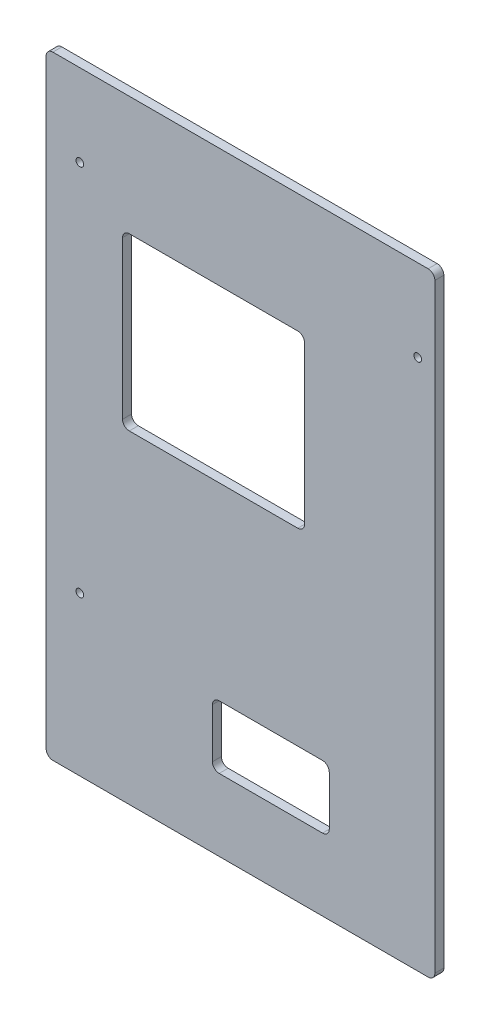
ISO-10303-21;
HEADER;
FILE_DESCRIPTION(('STEP AP214'),'2;1');
FILE_NAME('part.step','',(''),(''),'','','');
FILE_SCHEMA(('AUTOMOTIVE_DESIGN { 1 0 10303 214 1 1 1 1 }'));
ENDSEC;
DATA;
#1=APPLICATION_CONTEXT('core data for automotive mechanical design processes');
#2=APPLICATION_PROTOCOL_DEFINITION('international standard','automotive_design',2000,#1);
#3=PRODUCT_CONTEXT('',#1,'mechanical');
#4=PRODUCT('Part','Part','',(#3));
#5=PRODUCT_RELATED_PRODUCT_CATEGORY('part','',(#4));
#6=PRODUCT_DEFINITION_FORMATION('','',#4);
#7=PRODUCT_DEFINITION_CONTEXT('part definition',#1,'design');
#8=PRODUCT_DEFINITION('design','',#6,#7);
#9=PRODUCT_DEFINITION_SHAPE('','',#8);
#10=(LENGTH_UNIT() NAMED_UNIT(*) SI_UNIT(.MILLI.,.METRE.));
#11=(NAMED_UNIT(*) PLANE_ANGLE_UNIT() SI_UNIT($,.RADIAN.));
#12=(NAMED_UNIT(*) SI_UNIT($,.STERADIAN.) SOLID_ANGLE_UNIT());
#13=UNCERTAINTY_MEASURE_WITH_UNIT(LENGTH_MEASURE(1.E-05),#10,'distance_accuracy_value','');
#14=(GEOMETRIC_REPRESENTATION_CONTEXT(3) GLOBAL_UNCERTAINTY_ASSIGNED_CONTEXT((#13)) GLOBAL_UNIT_ASSIGNED_CONTEXT((#10,
#11,#12)) REPRESENTATION_CONTEXT('',''));
#15=CARTESIAN_POINT('',(0.,0.,0.));
#16=DIRECTION('',(0.,0.,1.));
#17=DIRECTION('',(1.,0.,0.));
#18=AXIS2_PLACEMENT_3D('',#15,#16,#17);
#19=CARTESIAN_POINT('',(0.,0.,0.));
#20=DIRECTION('',(0.,0.,-1.));
#21=DIRECTION('',(-1.,0.,0.));
#22=AXIS2_PLACEMENT_3D('',#19,#20,#21);
#23=PLANE('',#22);
#24=CARTESIAN_POINT('',(15.,236.5,0.));
#25=DIRECTION('',(0.,0.,1.));
#26=DIRECTION('',(1.,0.,0.));
#27=AXIS2_PLACEMENT_3D('',#24,#25,#26);
#28=CIRCLE('',#27,1.7);
#29=CARTESIAN_POINT('',(16.7,236.5,0.));
#30=VERTEX_POINT('',#29);
#31=EDGE_CURVE('E748',#30,#30,#28,.T.);
#32=ORIENTED_EDGE('',*,*,#31,.T.);
#33=EDGE_LOOP('',(#32));
#34=FACE_BOUND('',#33,.T.);
#35=DIRECTION('',(0.,1.,0.));
#36=VECTOR('',#35,1.);
#37=CARTESIAN_POINT('',(115.,220.,0.));
#38=LINE('',#37,#36);
#39=CARTESIAN_POINT('',(115.,147.,0.));
#40=VERTEX_POINT('',#39);
#41=CARTESIAN_POINT('',(115.,217.,0.));
#42=VERTEX_POINT('',#41);
#43=EDGE_CURVE('E433',#40,#42,#38,.T.);
#44=ORIENTED_EDGE('',*,*,#43,.T.);
#45=CARTESIAN_POINT('',(112.,217.,0.));
#46=DIRECTION('',(0.,0.,-1.));
#47=DIRECTION('',(-1.,0.,0.));
#48=AXIS2_PLACEMENT_3D('',#45,#46,#47);
#49=CIRCLE('',#48,3.);
#50=CARTESIAN_POINT('',(112.,220.,0.));
#51=VERTEX_POINT('',#50);
#52=EDGE_CURVE('E378',#42,#51,#49,.F.);
#53=ORIENTED_EDGE('',*,*,#52,.T.);
#54=DIRECTION('',(-1.,0.,0.));
#55=VECTOR('',#54,1.);
#56=CARTESIAN_POINT('',(34.,220.,0.));
#57=LINE('',#56,#55);
#58=CARTESIAN_POINT('',(37.,220.,0.));
#59=VERTEX_POINT('',#58);
#60=EDGE_CURVE('E392',#51,#59,#57,.T.);
#61=ORIENTED_EDGE('',*,*,#60,.T.);
#62=CARTESIAN_POINT('',(37.,217.,0.));
#63=DIRECTION('',(0.,0.,-1.));
#64=DIRECTION('',(-1.,0.,0.));
#65=AXIS2_PLACEMENT_3D('',#62,#63,#64);
#66=CIRCLE('',#65,3.);
#67=CARTESIAN_POINT('',(34.,217.,0.));
#68=VERTEX_POINT('',#67);
#69=EDGE_CURVE('E48',#59,#68,#66,.F.);
#70=ORIENTED_EDGE('',*,*,#69,.T.);
#71=DIRECTION('',(0.,-1.,0.));
#72=VECTOR('',#71,1.);
#73=CARTESIAN_POINT('',(34.,220.,0.));
#74=LINE('',#73,#72);
#75=CARTESIAN_POINT('',(34.,147.,0.));
#76=VERTEX_POINT('',#75);
#77=EDGE_CURVE('E390',#68,#76,#74,.T.);
#78=ORIENTED_EDGE('',*,*,#77,.T.);
#79=CARTESIAN_POINT('',(37.,147.,0.));
#80=DIRECTION('',(0.,0.,-1.));
#81=DIRECTION('',(-1.,0.,0.));
#82=AXIS2_PLACEMENT_3D('',#79,#80,#81);
#83=CIRCLE('',#82,3.);
#84=CARTESIAN_POINT('',(37.,144.,0.));
#85=VERTEX_POINT('',#84);
#86=EDGE_CURVE('E372',#76,#85,#83,.F.);
#87=ORIENTED_EDGE('',*,*,#86,.T.);
#88=DIRECTION('',(1.,0.,0.));
#89=VECTOR('',#88,1.);
#90=CARTESIAN_POINT('',(34.,144.,0.));
#91=LINE('',#90,#89);
#92=CARTESIAN_POINT('',(112.,144.,0.));
#93=VERTEX_POINT('',#92);
#94=EDGE_CURVE('E402',#85,#93,#91,.T.);
#95=ORIENTED_EDGE('',*,*,#94,.T.);
#96=CARTESIAN_POINT('',(112.,147.,0.));
#97=DIRECTION('',(0.,0.,-1.));
#98=DIRECTION('',(-1.,0.,0.));
#99=AXIS2_PLACEMENT_3D('',#96,#97,#98);
#100=CIRCLE('',#99,3.);
#101=EDGE_CURVE('E367',#93,#40,#100,.F.);
#102=ORIENTED_EDGE('',*,*,#101,.T.);
#103=EDGE_LOOP('',(#44,#53,#61,#70,#78,#87,#95,#102));
#104=FACE_BOUND('',#103,.T.);
#105=DIRECTION('',(0.,1.,0.));
#106=VECTOR('',#105,1.);
#107=CARTESIAN_POINT('',(126.,60.,0.));
#108=LINE('',#107,#106);
#109=CARTESIAN_POINT('',(126.,35.,0.));
#110=VERTEX_POINT('',#109);
#111=CARTESIAN_POINT('',(126.,57.,0.));
#112=VERTEX_POINT('',#111);
#113=EDGE_CURVE('E457',#110,#112,#108,.T.);
#114=ORIENTED_EDGE('',*,*,#113,.T.);
#115=CARTESIAN_POINT('',(123.,57.,0.));
#116=DIRECTION('',(0.,0.,-1.));
#117=DIRECTION('',(-1.,0.,0.));
#118=AXIS2_PLACEMENT_3D('',#115,#116,#117);
#119=CIRCLE('',#118,3.);
#120=CARTESIAN_POINT('',(123.,60.,0.));
#121=VERTEX_POINT('',#120);
#122=EDGE_CURVE('E355',#112,#121,#119,.F.);
#123=ORIENTED_EDGE('',*,*,#122,.T.);
#124=DIRECTION('',(-1.,0.,0.));
#125=VECTOR('',#124,1.);
#126=CARTESIAN_POINT('',(74.,60.,0.));
#127=LINE('',#126,#125);
#128=CARTESIAN_POINT('',(77.,60.,0.));
#129=VERTEX_POINT('',#128);
#130=EDGE_CURVE('E443',#121,#129,#127,.T.);
#131=ORIENTED_EDGE('',*,*,#130,.T.);
#132=CARTESIAN_POINT('',(77.,57.,0.));
#133=DIRECTION('',(0.,0.,-1.));
#134=DIRECTION('',(-1.,0.,0.));
#135=AXIS2_PLACEMENT_3D('',#132,#133,#134);
#136=CIRCLE('',#135,3.);
#137=CARTESIAN_POINT('',(74.,57.,0.));
#138=VERTEX_POINT('',#137);
#139=EDGE_CURVE('E361',#129,#138,#136,.F.);
#140=ORIENTED_EDGE('',*,*,#139,.T.);
#141=DIRECTION('',(0.,-1.,0.));
#142=VECTOR('',#141,1.);
#143=CARTESIAN_POINT('',(74.,60.,0.));
#144=LINE('',#143,#142);
#145=CARTESIAN_POINT('',(74.,35.,0.));
#146=VERTEX_POINT('',#145);
#147=EDGE_CURVE('E417',#138,#146,#144,.T.);
#148=ORIENTED_EDGE('',*,*,#147,.T.);
#149=CARTESIAN_POINT('',(77.,35.,0.));
#150=DIRECTION('',(0.,0.,-1.));
#151=DIRECTION('',(-1.,0.,0.));
#152=AXIS2_PLACEMENT_3D('',#149,#150,#151);
#153=CIRCLE('',#152,3.);
#154=CARTESIAN_POINT('',(77.,32.,0.));
#155=VERTEX_POINT('',#154);
#156=EDGE_CURVE('E349',#146,#155,#153,.F.);
#157=ORIENTED_EDGE('',*,*,#156,.T.);
#158=DIRECTION('',(1.,0.,0.));
#159=VECTOR('',#158,1.);
#160=CARTESIAN_POINT('',(74.,32.,0.));
#161=LINE('',#160,#159);
#162=CARTESIAN_POINT('',(123.,32.,0.));
#163=VERTEX_POINT('',#162);
#164=EDGE_CURVE('E423',#155,#163,#161,.T.);
#165=ORIENTED_EDGE('',*,*,#164,.T.);
#166=CARTESIAN_POINT('',(123.,35.,0.));
#167=DIRECTION('',(0.,0.,-1.));
#168=DIRECTION('',(-1.,0.,0.));
#169=AXIS2_PLACEMENT_3D('',#166,#167,#168);
#170=CIRCLE('',#169,3.);
#171=EDGE_CURVE('E343',#163,#110,#170,.F.);
#172=ORIENTED_EDGE('',*,*,#171,.T.);
#173=EDGE_LOOP('',(#114,#123,#131,#140,#148,#157,#165,#172));
#174=FACE_BOUND('',#173,.T.);
#175=DIRECTION('',(1.,0.,0.));
#176=VECTOR('',#175,1.);
#177=CARTESIAN_POINT('',(0.,0.,0.));
#178=LINE('',#177,#176);
#179=CARTESIAN_POINT('',(3.,0.,0.));
#180=VERTEX_POINT('',#179);
#181=CARTESIAN_POINT('',(170.,0.,0.));
#182=VERTEX_POINT('',#181);
#183=EDGE_CURVE('E220',#180,#182,#178,.T.);
#184=ORIENTED_EDGE('',*,*,#183,.F.);
#185=CARTESIAN_POINT('',(3.,3.,0.));
#186=DIRECTION('',(0.,0.,-1.));
#187=DIRECTION('',(-1.,0.,0.));
#188=AXIS2_PLACEMENT_3D('',#185,#186,#187);
#189=CIRCLE('',#188,3.);
#190=CARTESIAN_POINT('',(0.,3.,0.));
#191=VERTEX_POINT('',#190);
#192=EDGE_CURVE('E202',#180,#191,#189,.T.);
#193=ORIENTED_EDGE('',*,*,#192,.T.);
#194=DIRECTION('',(0.,-1.,0.));
#195=VECTOR('',#194,1.);
#196=CARTESIAN_POINT('',(0.,0.,0.));
#197=LINE('',#196,#195);
#198=CARTESIAN_POINT('',(0.,270.,0.));
#199=VERTEX_POINT('',#198);
#200=EDGE_CURVE('E232',#199,#191,#197,.T.);
#201=ORIENTED_EDGE('',*,*,#200,.F.);
#202=CARTESIAN_POINT('',(3.,270.,0.));
#203=DIRECTION('',(0.,0.,-1.));
#204=DIRECTION('',(-1.,0.,0.));
#205=AXIS2_PLACEMENT_3D('',#202,#203,#204);
#206=CIRCLE('',#205,3.);
#207=CARTESIAN_POINT('',(3.,273.,0.));
#208=VERTEX_POINT('',#207);
#209=EDGE_CURVE('E225',#199,#208,#206,.T.);
#210=ORIENTED_EDGE('',*,*,#209,.T.);
#211=DIRECTION('',(-1.,0.,0.));
#212=VECTOR('',#211,1.);
#213=CARTESIAN_POINT('',(0.,273.,0.));
#214=LINE('',#213,#212);
#215=CARTESIAN_POINT('',(170.,273.,0.));
#216=VERTEX_POINT('',#215);
#217=EDGE_CURVE('E237',#216,#208,#214,.T.);
#218=ORIENTED_EDGE('',*,*,#217,.F.);
#219=CARTESIAN_POINT('',(170.,270.,0.));
#220=DIRECTION('',(0.,0.,-1.));
#221=DIRECTION('',(-1.,0.,0.));
#222=AXIS2_PLACEMENT_3D('',#219,#220,#221);
#223=CIRCLE('',#222,3.);
#224=CARTESIAN_POINT('',(173.,270.,0.));
#225=VERTEX_POINT('',#224);
#226=EDGE_CURVE('E252',#216,#225,#223,.T.);
#227=ORIENTED_EDGE('',*,*,#226,.T.);
#228=DIRECTION('',(0.,1.,0.));
#229=VECTOR('',#228,1.);
#230=CARTESIAN_POINT('',(173.,0.,0.));
#231=LINE('',#230,#229);
#232=CARTESIAN_POINT('',(173.,3.,0.));
#233=VERTEX_POINT('',#232);
#234=EDGE_CURVE('E231',#233,#225,#231,.T.);
#235=ORIENTED_EDGE('',*,*,#234,.F.);
#236=CARTESIAN_POINT('',(170.,3.,0.));
#237=DIRECTION('',(0.,0.,-1.));
#238=DIRECTION('',(-1.,0.,0.));
#239=AXIS2_PLACEMENT_3D('',#236,#237,#238);
#240=CIRCLE('',#239,3.);
#241=EDGE_CURVE('E214',#233,#182,#240,.T.);
#242=ORIENTED_EDGE('',*,*,#241,.T.);
#243=EDGE_LOOP('',(#184,#193,#201,#210,#218,#227,#235,#242));
#244=FACE_BOUND('',#243,.T.);
#245=CARTESIAN_POINT('',(165.38,236.5,0.));
#246=DIRECTION('',(0.,0.,1.));
#247=DIRECTION('',(1.,0.,0.));
#248=AXIS2_PLACEMENT_3D('',#245,#246,#247);
#249=CIRCLE('',#248,1.70000000000001);
#250=CARTESIAN_POINT('',(167.08,236.5,0.));
#251=VERTEX_POINT('',#250);
#252=EDGE_CURVE('E403',#251,#251,#249,.T.);
#253=ORIENTED_EDGE('',*,*,#252,.T.);
#254=EDGE_LOOP('',(#253));
#255=FACE_BOUND('',#254,.T.);
#256=CARTESIAN_POINT('',(15.,70.5,0.));
#257=DIRECTION('',(0.,0.,1.));
#258=DIRECTION('',(1.,0.,0.));
#259=AXIS2_PLACEMENT_3D('',#256,#257,#258);
#260=CIRCLE('',#259,1.7);
#261=CARTESIAN_POINT('',(16.7,70.5,0.));
#262=VERTEX_POINT('',#261);
#263=EDGE_CURVE('E740',#262,#262,#260,.T.);
#264=ORIENTED_EDGE('',*,*,#263,.T.);
#265=EDGE_LOOP('',(#264));
#266=FACE_BOUND('',#265,.T.);
#267=ADVANCED_FACE('F39',(#34,#104,#174,#244,#255,#266),#23,.T.);
#268=CARTESIAN_POINT('',(0.,0.,4.));
#269=DIRECTION('',(0.,0.,-1.));
#270=DIRECTION('',(-1.,0.,0.));
#271=AXIS2_PLACEMENT_3D('',#268,#269,#270);
#272=PLANE('',#271);
#273=CARTESIAN_POINT('',(15.,236.5,4.));
#274=DIRECTION('',(0.,0.,1.));
#275=DIRECTION('',(1.,0.,0.));
#276=AXIS2_PLACEMENT_3D('',#273,#274,#275);
#277=CIRCLE('',#276,1.69999999999999);
#278=CARTESIAN_POINT('',(16.7,236.5,4.));
#279=VERTEX_POINT('',#278);
#280=EDGE_CURVE('E751',#279,#279,#277,.T.);
#281=ORIENTED_EDGE('',*,*,#280,.F.);
#282=EDGE_LOOP('',(#281));
#283=FACE_BOUND('',#282,.T.);
#284=CARTESIAN_POINT('',(15.,70.5,4.));
#285=DIRECTION('',(0.,0.,1.));
#286=DIRECTION('',(1.,0.,0.));
#287=AXIS2_PLACEMENT_3D('',#284,#285,#286);
#288=CIRCLE('',#287,1.69999999999999);
#289=CARTESIAN_POINT('',(16.7,70.5,4.));
#290=VERTEX_POINT('',#289);
#291=EDGE_CURVE('E744',#290,#290,#288,.T.);
#292=ORIENTED_EDGE('',*,*,#291,.F.);
#293=EDGE_LOOP('',(#292));
#294=FACE_BOUND('',#293,.T.);
#295=CARTESIAN_POINT('',(165.38,236.5,4.));
#296=DIRECTION('',(0.,0.,1.));
#297=DIRECTION('',(1.,0.,0.));
#298=AXIS2_PLACEMENT_3D('',#295,#296,#297);
#299=CIRCLE('',#298,1.69999999999998);
#300=CARTESIAN_POINT('',(167.08,236.5,4.));
#301=VERTEX_POINT('',#300);
#302=EDGE_CURVE('E736',#301,#301,#299,.T.);
#303=ORIENTED_EDGE('',*,*,#302,.F.);
#304=EDGE_LOOP('',(#303));
#305=FACE_BOUND('',#304,.T.);
#306=DIRECTION('',(0.,-1.,0.));
#307=VECTOR('',#306,1.);
#308=CARTESIAN_POINT('',(74.,60.,4.));
#309=LINE('',#308,#307);
#310=CARTESIAN_POINT('',(74.,57.,4.));
#311=VERTEX_POINT('',#310);
#312=CARTESIAN_POINT('',(74.,35.,4.));
#313=VERTEX_POINT('',#312);
#314=EDGE_CURVE('E438',#311,#313,#309,.T.);
#315=ORIENTED_EDGE('',*,*,#314,.F.);
#316=CARTESIAN_POINT('',(77.,57.,4.));
#317=DIRECTION('',(0.,0.,-1.));
#318=DIRECTION('',(-1.,0.,0.));
#319=AXIS2_PLACEMENT_3D('',#316,#317,#318);
#320=CIRCLE('',#319,3.);
#321=CARTESIAN_POINT('',(77.,60.,4.));
#322=VERTEX_POINT('',#321);
#323=EDGE_CURVE('E364',#311,#322,#320,.T.);
#324=ORIENTED_EDGE('',*,*,#323,.T.);
#325=DIRECTION('',(-1.,0.,0.));
#326=VECTOR('',#325,1.);
#327=CARTESIAN_POINT('',(74.,60.,4.));
#328=LINE('',#327,#326);
#329=CARTESIAN_POINT('',(123.,60.,4.));
#330=VERTEX_POINT('',#329);
#331=EDGE_CURVE('E239',#330,#322,#328,.T.);
#332=ORIENTED_EDGE('',*,*,#331,.F.);
#333=CARTESIAN_POINT('',(123.,57.,4.));
#334=DIRECTION('',(0.,0.,-1.));
#335=DIRECTION('',(-1.,0.,0.));
#336=AXIS2_PLACEMENT_3D('',#333,#334,#335);
#337=CIRCLE('',#336,3.);
#338=CARTESIAN_POINT('',(126.,57.,4.));
#339=VERTEX_POINT('',#338);
#340=EDGE_CURVE('E358',#330,#339,#337,.T.);
#341=ORIENTED_EDGE('',*,*,#340,.T.);
#342=DIRECTION('',(0.,1.,0.));
#343=VECTOR('',#342,1.);
#344=CARTESIAN_POINT('',(126.,60.,4.));
#345=LINE('',#344,#343);
#346=CARTESIAN_POINT('',(126.,35.,4.));
#347=VERTEX_POINT('',#346);
#348=EDGE_CURVE('E447',#347,#339,#345,.T.);
#349=ORIENTED_EDGE('',*,*,#348,.F.);
#350=CARTESIAN_POINT('',(123.,35.,4.));
#351=DIRECTION('',(0.,0.,-1.));
#352=DIRECTION('',(-1.,0.,0.));
#353=AXIS2_PLACEMENT_3D('',#350,#351,#352);
#354=CIRCLE('',#353,3.);
#355=CARTESIAN_POINT('',(123.,32.,4.));
#356=VERTEX_POINT('',#355);
#357=EDGE_CURVE('E346',#347,#356,#354,.T.);
#358=ORIENTED_EDGE('',*,*,#357,.T.);
#359=DIRECTION('',(1.,0.,0.));
#360=VECTOR('',#359,1.);
#361=CARTESIAN_POINT('',(74.,32.,4.));
#362=LINE('',#361,#360);
#363=CARTESIAN_POINT('',(77.,32.,4.));
#364=VERTEX_POINT('',#363);
#365=EDGE_CURVE('E442',#364,#356,#362,.T.);
#366=ORIENTED_EDGE('',*,*,#365,.F.);
#367=CARTESIAN_POINT('',(77.,35.,4.));
#368=DIRECTION('',(0.,0.,-1.));
#369=DIRECTION('',(-1.,0.,0.));
#370=AXIS2_PLACEMENT_3D('',#367,#368,#369);
#371=CIRCLE('',#370,3.);
#372=EDGE_CURVE('E352',#364,#313,#371,.T.);
#373=ORIENTED_EDGE('',*,*,#372,.T.);
#374=EDGE_LOOP('',(#315,#324,#332,#341,#349,#358,#366,#373));
#375=FACE_BOUND('',#374,.T.);
#376=DIRECTION('',(0.,-1.,0.));
#377=VECTOR('',#376,1.);
#378=CARTESIAN_POINT('',(0.,0.,4.));
#379=LINE('',#378,#377);
#380=CARTESIAN_POINT('',(0.,270.,4.));
#381=VERTEX_POINT('',#380);
#382=CARTESIAN_POINT('',(0.,3.,4.));
#383=VERTEX_POINT('',#382);
#384=EDGE_CURVE('E246',#381,#383,#379,.T.);
#385=ORIENTED_EDGE('',*,*,#384,.T.);
#386=CARTESIAN_POINT('',(3.,3.,4.));
#387=DIRECTION('',(0.,0.,-1.));
#388=DIRECTION('',(-1.,0.,0.));
#389=AXIS2_PLACEMENT_3D('',#386,#387,#388);
#390=CIRCLE('',#389,3.);
#391=CARTESIAN_POINT('',(3.,0.,4.));
#392=VERTEX_POINT('',#391);
#393=EDGE_CURVE('E271',#383,#392,#390,.F.);
#394=ORIENTED_EDGE('',*,*,#393,.T.);
#395=DIRECTION('',(1.,0.,0.));
#396=VECTOR('',#395,1.);
#397=CARTESIAN_POINT('',(0.,0.,4.));
#398=LINE('',#397,#396);
#399=CARTESIAN_POINT('',(170.,0.,4.));
#400=VERTEX_POINT('',#399);
#401=EDGE_CURVE('E223',#392,#400,#398,.T.);
#402=ORIENTED_EDGE('',*,*,#401,.T.);
#403=CARTESIAN_POINT('',(170.,3.,4.));
#404=DIRECTION('',(0.,0.,-1.));
#405=DIRECTION('',(-1.,0.,0.));
#406=AXIS2_PLACEMENT_3D('',#403,#404,#405);
#407=CIRCLE('',#406,3.);
#408=CARTESIAN_POINT('',(173.,3.,4.));
#409=VERTEX_POINT('',#408);
#410=EDGE_CURVE('E268',#400,#409,#407,.F.);
#411=ORIENTED_EDGE('',*,*,#410,.T.);
#412=DIRECTION('',(0.,1.,0.));
#413=VECTOR('',#412,1.);
#414=CARTESIAN_POINT('',(173.,0.,4.));
#415=LINE('',#414,#413);
#416=CARTESIAN_POINT('',(173.,270.,4.));
#417=VERTEX_POINT('',#416);
#418=EDGE_CURVE('E469',#409,#417,#415,.T.);
#419=ORIENTED_EDGE('',*,*,#418,.T.);
#420=CARTESIAN_POINT('',(170.,270.,4.));
#421=DIRECTION('',(0.,0.,-1.));
#422=DIRECTION('',(-1.,0.,0.));
#423=AXIS2_PLACEMENT_3D('',#420,#421,#422);
#424=CIRCLE('',#423,3.);
#425=CARTESIAN_POINT('',(170.,273.,4.));
#426=VERTEX_POINT('',#425);
#427=EDGE_CURVE('E265',#417,#426,#424,.F.);
#428=ORIENTED_EDGE('',*,*,#427,.T.);
#429=DIRECTION('',(-1.,0.,0.));
#430=VECTOR('',#429,1.);
#431=CARTESIAN_POINT('',(0.,273.,4.));
#432=LINE('',#431,#430);
#433=CARTESIAN_POINT('',(3.,273.,4.));
#434=VERTEX_POINT('',#433);
#435=EDGE_CURVE('E248',#426,#434,#432,.T.);
#436=ORIENTED_EDGE('',*,*,#435,.T.);
#437=CARTESIAN_POINT('',(3.,270.,4.));
#438=DIRECTION('',(0.,0.,-1.));
#439=DIRECTION('',(-1.,0.,0.));
#440=AXIS2_PLACEMENT_3D('',#437,#438,#439);
#441=CIRCLE('',#440,3.);
#442=EDGE_CURVE('E262',#434,#381,#441,.F.);
#443=ORIENTED_EDGE('',*,*,#442,.T.);
#444=EDGE_LOOP('',(#385,#394,#402,#411,#419,#428,#436,#443));
#445=FACE_BOUND('',#444,.T.);
#446=DIRECTION('',(0.,-1.,0.));
#447=VECTOR('',#446,1.);
#448=CARTESIAN_POINT('',(34.,220.,4.));
#449=LINE('',#448,#447);
#450=CARTESIAN_POINT('',(34.,217.,4.));
#451=VERTEX_POINT('',#450);
#452=CARTESIAN_POINT('',(34.,147.,4.));
#453=VERTEX_POINT('',#452);
#454=EDGE_CURVE('E412',#451,#453,#449,.T.);
#455=ORIENTED_EDGE('',*,*,#454,.F.);
#456=CARTESIAN_POINT('',(37.,217.,4.));
#457=DIRECTION('',(0.,0.,-1.));
#458=DIRECTION('',(-1.,0.,0.));
#459=AXIS2_PLACEMENT_3D('',#456,#457,#458);
#460=CIRCLE('',#459,3.);
#461=CARTESIAN_POINT('',(37.,220.,4.));
#462=VERTEX_POINT('',#461);
#463=EDGE_CURVE('E11',#451,#462,#460,.T.);
#464=ORIENTED_EDGE('',*,*,#463,.T.);
#465=DIRECTION('',(-1.,0.,0.));
#466=VECTOR('',#465,1.);
#467=CARTESIAN_POINT('',(34.,220.,4.));
#468=LINE('',#467,#466);
#469=CARTESIAN_POINT('',(112.,220.,4.));
#470=VERTEX_POINT('',#469);
#471=EDGE_CURVE('E410',#470,#462,#468,.T.);
#472=ORIENTED_EDGE('',*,*,#471,.F.);
#473=CARTESIAN_POINT('',(112.,217.,4.));
#474=DIRECTION('',(0.,0.,-1.));
#475=DIRECTION('',(-1.,0.,0.));
#476=AXIS2_PLACEMENT_3D('',#473,#474,#475);
#477=CIRCLE('',#476,3.);
#478=CARTESIAN_POINT('',(115.,217.,4.));
#479=VERTEX_POINT('',#478);
#480=EDGE_CURVE('E381',#470,#479,#477,.T.);
#481=ORIENTED_EDGE('',*,*,#480,.T.);
#482=DIRECTION('',(0.,1.,0.));
#483=VECTOR('',#482,1.);
#484=CARTESIAN_POINT('',(115.,220.,4.));
#485=LINE('',#484,#483);
#486=CARTESIAN_POINT('',(115.,147.,4.));
#487=VERTEX_POINT('',#486);
#488=EDGE_CURVE('E418',#487,#479,#485,.T.);
#489=ORIENTED_EDGE('',*,*,#488,.F.);
#490=CARTESIAN_POINT('',(112.,147.,4.));
#491=DIRECTION('',(0.,0.,-1.));
#492=DIRECTION('',(-1.,0.,0.));
#493=AXIS2_PLACEMENT_3D('',#490,#491,#492);
#494=CIRCLE('',#493,3.);
#495=CARTESIAN_POINT('',(112.,144.,4.));
#496=VERTEX_POINT('',#495);
#497=EDGE_CURVE('E55',#487,#496,#494,.T.);
#498=ORIENTED_EDGE('',*,*,#497,.T.);
#499=DIRECTION('',(1.,0.,0.));
#500=VECTOR('',#499,1.);
#501=CARTESIAN_POINT('',(34.,144.,4.));
#502=LINE('',#501,#500);
#503=CARTESIAN_POINT('',(37.,144.,4.));
#504=VERTEX_POINT('',#503);
#505=EDGE_CURVE('E426',#504,#496,#502,.T.);
#506=ORIENTED_EDGE('',*,*,#505,.F.);
#507=CARTESIAN_POINT('',(37.,147.,4.));
#508=DIRECTION('',(0.,0.,-1.));
#509=DIRECTION('',(-1.,0.,0.));
#510=AXIS2_PLACEMENT_3D('',#507,#508,#509);
#511=CIRCLE('',#510,3.);
#512=EDGE_CURVE('E375',#504,#453,#511,.T.);
#513=ORIENTED_EDGE('',*,*,#512,.T.);
#514=EDGE_LOOP('',(#455,#464,#472,#481,#489,#498,#506,#513));
#515=FACE_BOUND('',#514,.T.);
#516=ADVANCED_FACE('F409',(#283,#294,#305,#375,#445,#515),#272,.F.);
#517=CARTESIAN_POINT('',(0.,0.,4.));
#518=DIRECTION('',(1.,0.,0.));
#519=DIRECTION('',(0.,0.,-1.));
#520=AXIS2_PLACEMENT_3D('',#517,#518,#519);
#521=PLANE('',#520);
#522=ORIENTED_EDGE('',*,*,#200,.T.);
#523=DIRECTION('',(0.,0.,-1.));
#524=VECTOR('',#523,1.);
#525=CARTESIAN_POINT('',(0.,3.,4.));
#526=LINE('',#525,#524);
#527=EDGE_CURVE('E207',#191,#383,#526,.F.);
#528=ORIENTED_EDGE('',*,*,#527,.T.);
#529=ORIENTED_EDGE('',*,*,#384,.F.);
#530=DIRECTION('',(0.,0.,-1.));
#531=VECTOR('',#530,1.);
#532=CARTESIAN_POINT('',(0.,270.,4.));
#533=LINE('',#532,#531);
#534=EDGE_CURVE('E213',#381,#199,#533,.T.);
#535=ORIENTED_EDGE('',*,*,#534,.T.);
#536=EDGE_LOOP('',(#522,#528,#529,#535));
#537=FACE_BOUND('',#536,.T.);
#538=ADVANCED_FACE('F485',(#537),#521,.F.);
#539=CARTESIAN_POINT('',(0.,0.,4.));
#540=DIRECTION('',(0.,1.,0.));
#541=DIRECTION('',(0.,0.,1.));
#542=AXIS2_PLACEMENT_3D('',#539,#540,#541);
#543=PLANE('',#542);
#544=ORIENTED_EDGE('',*,*,#401,.F.);
#545=DIRECTION('',(0.,0.,-1.));
#546=VECTOR('',#545,1.);
#547=CARTESIAN_POINT('',(3.,0.,4.));
#548=LINE('',#547,#546);
#549=EDGE_CURVE('E206',#392,#180,#548,.T.);
#550=ORIENTED_EDGE('',*,*,#549,.T.);
#551=ORIENTED_EDGE('',*,*,#183,.T.);
#552=DIRECTION('',(0.,0.,-1.));
#553=VECTOR('',#552,1.);
#554=CARTESIAN_POINT('',(170.,0.,4.));
#555=LINE('',#554,#553);
#556=EDGE_CURVE('E226',#182,#400,#555,.F.);
#557=ORIENTED_EDGE('',*,*,#556,.T.);
#558=EDGE_LOOP('',(#544,#550,#551,#557));
#559=FACE_BOUND('',#558,.T.);
#560=ADVANCED_FACE('F219',(#559),#543,.F.);
#561=CARTESIAN_POINT('',(173.,0.,4.));
#562=DIRECTION('',(-1.,0.,0.));
#563=DIRECTION('',(0.,0.,1.));
#564=AXIS2_PLACEMENT_3D('',#561,#562,#563);
#565=PLANE('',#564);
#566=ORIENTED_EDGE('',*,*,#418,.F.);
#567=DIRECTION('',(0.,0.,-1.));
#568=VECTOR('',#567,1.);
#569=CARTESIAN_POINT('',(173.,3.,4.));
#570=LINE('',#569,#568);
#571=EDGE_CURVE('E277',#409,#233,#570,.T.);
#572=ORIENTED_EDGE('',*,*,#571,.T.);
#573=ORIENTED_EDGE('',*,*,#234,.T.);
#574=DIRECTION('',(0.,0.,-1.));
#575=VECTOR('',#574,1.);
#576=CARTESIAN_POINT('',(173.,270.,4.));
#577=LINE('',#576,#575);
#578=EDGE_CURVE('E274',#225,#417,#577,.F.);
#579=ORIENTED_EDGE('',*,*,#578,.T.);
#580=EDGE_LOOP('',(#566,#572,#573,#579));
#581=FACE_BOUND('',#580,.T.);
#582=ADVANCED_FACE('F493',(#581),#565,.F.);
#583=CARTESIAN_POINT('',(0.,273.,4.));
#584=DIRECTION('',(0.,-1.,0.));
#585=DIRECTION('',(0.,0.,-1.));
#586=AXIS2_PLACEMENT_3D('',#583,#584,#585);
#587=PLANE('',#586);
#588=ORIENTED_EDGE('',*,*,#435,.F.);
#589=DIRECTION('',(0.,0.,-1.));
#590=VECTOR('',#589,1.);
#591=CARTESIAN_POINT('',(170.,273.,4.));
#592=LINE('',#591,#590);
#593=EDGE_CURVE('E339',#426,#216,#592,.T.);
#594=ORIENTED_EDGE('',*,*,#593,.T.);
#595=ORIENTED_EDGE('',*,*,#217,.T.);
#596=DIRECTION('',(0.,0.,-1.));
#597=VECTOR('',#596,1.);
#598=CARTESIAN_POINT('',(3.,273.,4.));
#599=LINE('',#598,#597);
#600=EDGE_CURVE('E336',#208,#434,#599,.F.);
#601=ORIENTED_EDGE('',*,*,#600,.T.);
#602=EDGE_LOOP('',(#588,#594,#595,#601));
#603=FACE_BOUND('',#602,.T.);
#604=ADVANCED_FACE('F487',(#603),#587,.F.);
#605=CARTESIAN_POINT('',(74.,60.,4.));
#606=DIRECTION('',(1.,0.,0.));
#607=DIRECTION('',(0.,0.,-1.));
#608=AXIS2_PLACEMENT_3D('',#605,#606,#607);
#609=PLANE('',#608);
#610=ORIENTED_EDGE('',*,*,#314,.T.);
#611=DIRECTION('',(0.,0.,-1.));
#612=VECTOR('',#611,1.);
#613=CARTESIAN_POINT('',(74.,35.,0.));
#614=LINE('',#613,#612);
#615=EDGE_CURVE('E298',#313,#146,#614,.T.);
#616=ORIENTED_EDGE('',*,*,#615,.T.);
#617=ORIENTED_EDGE('',*,*,#147,.F.);
#618=DIRECTION('',(0.,0.,-1.));
#619=VECTOR('',#618,1.);
#620=CARTESIAN_POINT('',(74.,57.,4.));
#621=LINE('',#620,#619);
#622=EDGE_CURVE('E295',#138,#311,#621,.F.);
#623=ORIENTED_EDGE('',*,*,#622,.T.);
#624=EDGE_LOOP('',(#610,#616,#617,#623));
#625=FACE_BOUND('',#624,.T.);
#626=ADVANCED_FACE('F523',(#625),#609,.T.);
#627=CARTESIAN_POINT('',(74.,32.,4.));
#628=DIRECTION('',(0.,1.,0.));
#629=DIRECTION('',(0.,0.,1.));
#630=AXIS2_PLACEMENT_3D('',#627,#628,#629);
#631=PLANE('',#630);
#632=ORIENTED_EDGE('',*,*,#365,.T.);
#633=DIRECTION('',(0.,0.,-1.));
#634=VECTOR('',#633,1.);
#635=CARTESIAN_POINT('',(123.,32.,0.));
#636=LINE('',#635,#634);
#637=EDGE_CURVE('E284',#356,#163,#636,.T.);
#638=ORIENTED_EDGE('',*,*,#637,.T.);
#639=ORIENTED_EDGE('',*,*,#164,.F.);
#640=DIRECTION('',(0.,0.,-1.));
#641=VECTOR('',#640,1.);
#642=CARTESIAN_POINT('',(77.,32.,4.));
#643=LINE('',#642,#641);
#644=EDGE_CURVE('E281',#155,#364,#643,.F.);
#645=ORIENTED_EDGE('',*,*,#644,.T.);
#646=EDGE_LOOP('',(#632,#638,#639,#645));
#647=FACE_BOUND('',#646,.T.);
#648=ADVANCED_FACE('F551',(#647),#631,.T.);
#649=CARTESIAN_POINT('',(126.,60.,4.));
#650=DIRECTION('',(-1.,0.,0.));
#651=DIRECTION('',(0.,0.,1.));
#652=AXIS2_PLACEMENT_3D('',#649,#650,#651);
#653=PLANE('',#652);
#654=ORIENTED_EDGE('',*,*,#113,.F.);
#655=DIRECTION('',(0.,0.,-1.));
#656=VECTOR('',#655,1.);
#657=CARTESIAN_POINT('',(126.,35.,4.));
#658=LINE('',#657,#656);
#659=EDGE_CURVE('E292',#110,#347,#658,.F.);
#660=ORIENTED_EDGE('',*,*,#659,.T.);
#661=ORIENTED_EDGE('',*,*,#348,.T.);
#662=DIRECTION('',(0.,0.,-1.));
#663=VECTOR('',#662,1.);
#664=CARTESIAN_POINT('',(126.,57.,0.));
#665=LINE('',#664,#663);
#666=EDGE_CURVE('E288',#339,#112,#665,.T.);
#667=ORIENTED_EDGE('',*,*,#666,.T.);
#668=EDGE_LOOP('',(#654,#660,#661,#667));
#669=FACE_BOUND('',#668,.T.);
#670=ADVANCED_FACE('F558',(#669),#653,.T.);
#671=CARTESIAN_POINT('',(74.,60.,4.));
#672=DIRECTION('',(0.,-1.,0.));
#673=DIRECTION('',(1.,0.,0.));
#674=AXIS2_PLACEMENT_3D('',#671,#672,#673);
#675=PLANE('',#674);
#676=ORIENTED_EDGE('',*,*,#130,.F.);
#677=DIRECTION('',(0.,0.,-1.));
#678=VECTOR('',#677,1.);
#679=CARTESIAN_POINT('',(123.,60.,4.));
#680=LINE('',#679,#678);
#681=EDGE_CURVE('E306',#121,#330,#680,.F.);
#682=ORIENTED_EDGE('',*,*,#681,.T.);
#683=ORIENTED_EDGE('',*,*,#331,.T.);
#684=DIRECTION('',(0.,0.,-1.));
#685=VECTOR('',#684,1.);
#686=CARTESIAN_POINT('',(77.,60.,0.));
#687=LINE('',#686,#685);
#688=EDGE_CURVE('E302',#322,#129,#687,.T.);
#689=ORIENTED_EDGE('',*,*,#688,.T.);
#690=EDGE_LOOP('',(#676,#682,#683,#689));
#691=FACE_BOUND('',#690,.T.);
#692=ADVANCED_FACE('F566',(#691),#675,.T.);
#693=CARTESIAN_POINT('',(34.,220.,4.));
#694=DIRECTION('',(1.,0.,0.));
#695=DIRECTION('',(0.,1.,0.));
#696=AXIS2_PLACEMENT_3D('',#693,#694,#695);
#697=PLANE('',#696);
#698=ORIENTED_EDGE('',*,*,#454,.T.);
#699=DIRECTION('',(0.,0.,-1.));
#700=VECTOR('',#699,1.);
#701=CARTESIAN_POINT('',(34.,147.,0.));
#702=LINE('',#701,#700);
#703=EDGE_CURVE('E325',#453,#76,#702,.T.);
#704=ORIENTED_EDGE('',*,*,#703,.T.);
#705=ORIENTED_EDGE('',*,*,#77,.F.);
#706=DIRECTION('',(0.,0.,-1.));
#707=VECTOR('',#706,1.);
#708=CARTESIAN_POINT('',(34.,217.,4.));
#709=LINE('',#708,#707);
#710=EDGE_CURVE('E322',#68,#451,#709,.F.);
#711=ORIENTED_EDGE('',*,*,#710,.T.);
#712=EDGE_LOOP('',(#698,#704,#705,#711));
#713=FACE_BOUND('',#712,.T.);
#714=ADVANCED_FACE('F398',(#713),#697,.T.);
#715=CARTESIAN_POINT('',(34.,144.,4.));
#716=DIRECTION('',(0.,1.,0.));
#717=DIRECTION('',(-1.,0.,0.));
#718=AXIS2_PLACEMENT_3D('',#715,#716,#717);
#719=PLANE('',#718);
#720=ORIENTED_EDGE('',*,*,#505,.T.);
#721=DIRECTION('',(0.,0.,-1.));
#722=VECTOR('',#721,1.);
#723=CARTESIAN_POINT('',(112.,144.,0.));
#724=LINE('',#723,#722);
#725=EDGE_CURVE('E311',#496,#93,#724,.T.);
#726=ORIENTED_EDGE('',*,*,#725,.T.);
#727=ORIENTED_EDGE('',*,*,#94,.F.);
#728=DIRECTION('',(0.,0.,-1.));
#729=VECTOR('',#728,1.);
#730=CARTESIAN_POINT('',(37.,144.,4.));
#731=LINE('',#730,#729);
#732=EDGE_CURVE('E62',#85,#504,#731,.F.);
#733=ORIENTED_EDGE('',*,*,#732,.T.);
#734=EDGE_LOOP('',(#720,#726,#727,#733));
#735=FACE_BOUND('',#734,.T.);
#736=ADVANCED_FACE('F581',(#735),#719,.T.);
#737=CARTESIAN_POINT('',(115.,220.,4.));
#738=DIRECTION('',(-1.,0.,0.));
#739=DIRECTION('',(0.,-1.,0.));
#740=AXIS2_PLACEMENT_3D('',#737,#738,#739);
#741=PLANE('',#740);
#742=ORIENTED_EDGE('',*,*,#43,.F.);
#743=DIRECTION('',(0.,0.,-1.));
#744=VECTOR('',#743,1.);
#745=CARTESIAN_POINT('',(115.,147.,4.));
#746=LINE('',#745,#744);
#747=EDGE_CURVE('E319',#40,#487,#746,.F.);
#748=ORIENTED_EDGE('',*,*,#747,.T.);
#749=ORIENTED_EDGE('',*,*,#488,.T.);
#750=DIRECTION('',(0.,0.,-1.));
#751=VECTOR('',#750,1.);
#752=CARTESIAN_POINT('',(115.,217.,0.));
#753=LINE('',#752,#751);
#754=EDGE_CURVE('E315',#479,#42,#753,.T.);
#755=ORIENTED_EDGE('',*,*,#754,.T.);
#756=EDGE_LOOP('',(#742,#748,#749,#755));
#757=FACE_BOUND('',#756,.T.);
#758=ADVANCED_FACE('F588',(#757),#741,.T.);
#759=CARTESIAN_POINT('',(34.,220.,4.));
#760=DIRECTION('',(0.,-1.,0.));
#761=DIRECTION('',(0.,0.,-1.));
#762=AXIS2_PLACEMENT_3D('',#759,#760,#761);
#763=PLANE('',#762);
#764=ORIENTED_EDGE('',*,*,#60,.F.);
#765=DIRECTION('',(0.,0.,-1.));
#766=VECTOR('',#765,1.);
#767=CARTESIAN_POINT('',(112.,220.,4.));
#768=LINE('',#767,#766);
#769=EDGE_CURVE('E333',#51,#470,#768,.F.);
#770=ORIENTED_EDGE('',*,*,#769,.T.);
#771=ORIENTED_EDGE('',*,*,#471,.T.);
#772=DIRECTION('',(0.,0.,-1.));
#773=VECTOR('',#772,1.);
#774=CARTESIAN_POINT('',(37.,220.,0.));
#775=LINE('',#774,#773);
#776=EDGE_CURVE('E329',#462,#59,#775,.T.);
#777=ORIENTED_EDGE('',*,*,#776,.T.);
#778=EDGE_LOOP('',(#764,#770,#771,#777));
#779=FACE_BOUND('',#778,.T.);
#780=ADVANCED_FACE('F414',(#779),#763,.T.);
#781=CARTESIAN_POINT('',(165.38,236.5,4.));
#782=DIRECTION('',(0.,0.,1.));
#783=DIRECTION('',(1.,0.,0.));
#784=AXIS2_PLACEMENT_3D('',#781,#782,#783);
#785=CYLINDRICAL_SURFACE('',#784,1.69999999999999);
#786=ORIENTED_EDGE('',*,*,#252,.F.);
#787=EDGE_LOOP('',(#786));
#788=FACE_BOUND('',#787,.T.);
#789=ORIENTED_EDGE('',*,*,#302,.T.);
#790=EDGE_LOOP('',(#789));
#791=FACE_BOUND('',#790,.T.);
#792=ADVANCED_FACE('F602',(#788,#791),#785,.F.);
#793=CARTESIAN_POINT('',(15.,70.5,4.));
#794=DIRECTION('',(0.,0.,1.));
#795=DIRECTION('',(1.,0.,0.));
#796=AXIS2_PLACEMENT_3D('',#793,#794,#795);
#797=CYLINDRICAL_SURFACE('',#796,1.69999999999999);
#798=ORIENTED_EDGE('',*,*,#263,.F.);
#799=EDGE_LOOP('',(#798));
#800=FACE_BOUND('',#799,.T.);
#801=ORIENTED_EDGE('',*,*,#291,.T.);
#802=EDGE_LOOP('',(#801));
#803=FACE_BOUND('',#802,.T.);
#804=ADVANCED_FACE('F610',(#800,#803),#797,.F.);
#805=CARTESIAN_POINT('',(15.,236.5,4.));
#806=DIRECTION('',(0.,0.,1.));
#807=DIRECTION('',(1.,0.,0.));
#808=AXIS2_PLACEMENT_3D('',#805,#806,#807);
#809=CYLINDRICAL_SURFACE('',#808,1.69999999999999);
#810=ORIENTED_EDGE('',*,*,#31,.F.);
#811=EDGE_LOOP('',(#810));
#812=FACE_BOUND('',#811,.T.);
#813=ORIENTED_EDGE('',*,*,#280,.T.);
#814=EDGE_LOOP('',(#813));
#815=FACE_BOUND('',#814,.T.);
#816=ADVANCED_FACE('F508',(#812,#815),#809,.F.);
#817=CARTESIAN_POINT('',(3.,3.,4.));
#818=DIRECTION('',(0.,0.,-1.));
#819=DIRECTION('',(-1.,0.,0.));
#820=AXIS2_PLACEMENT_3D('',#817,#818,#819);
#821=CYLINDRICAL_SURFACE('',#820,3.);
#822=ORIENTED_EDGE('',*,*,#393,.F.);
#823=ORIENTED_EDGE('',*,*,#527,.F.);
#824=ORIENTED_EDGE('',*,*,#192,.F.);
#825=ORIENTED_EDGE('',*,*,#549,.F.);
#826=EDGE_LOOP('',(#822,#823,#824,#825));
#827=FACE_BOUND('',#826,.T.);
#828=ADVANCED_FACE('F205',(#827),#821,.T.);
#829=CARTESIAN_POINT('',(170.,3.,4.));
#830=DIRECTION('',(0.,0.,-1.));
#831=DIRECTION('',(-1.,0.,0.));
#832=AXIS2_PLACEMENT_3D('',#829,#830,#831);
#833=CYLINDRICAL_SURFACE('',#832,3.);
#834=ORIENTED_EDGE('',*,*,#410,.F.);
#835=ORIENTED_EDGE('',*,*,#556,.F.);
#836=ORIENTED_EDGE('',*,*,#241,.F.);
#837=ORIENTED_EDGE('',*,*,#571,.F.);
#838=EDGE_LOOP('',(#834,#835,#836,#837));
#839=FACE_BOUND('',#838,.T.);
#840=ADVANCED_FACE('F497',(#839),#833,.T.);
#841=CARTESIAN_POINT('',(123.,35.,4.));
#842=DIRECTION('',(0.,0.,1.));
#843=DIRECTION('',(1.,0.,0.));
#844=AXIS2_PLACEMENT_3D('',#841,#842,#843);
#845=CYLINDRICAL_SURFACE('',#844,3.);
#846=ORIENTED_EDGE('',*,*,#357,.F.);
#847=ORIENTED_EDGE('',*,*,#659,.F.);
#848=ORIENTED_EDGE('',*,*,#171,.F.);
#849=ORIENTED_EDGE('',*,*,#637,.F.);
#850=EDGE_LOOP('',(#846,#847,#848,#849));
#851=FACE_BOUND('',#850,.T.);
#852=ADVANCED_FACE('F499',(#851),#845,.F.);
#853=CARTESIAN_POINT('',(77.,35.,4.));
#854=DIRECTION('',(0.,0.,1.));
#855=DIRECTION('',(1.,0.,0.));
#856=AXIS2_PLACEMENT_3D('',#853,#854,#855);
#857=CYLINDRICAL_SURFACE('',#856,3.);
#858=ORIENTED_EDGE('',*,*,#372,.F.);
#859=ORIENTED_EDGE('',*,*,#644,.F.);
#860=ORIENTED_EDGE('',*,*,#156,.F.);
#861=ORIENTED_EDGE('',*,*,#615,.F.);
#862=EDGE_LOOP('',(#858,#859,#860,#861));
#863=FACE_BOUND('',#862,.T.);
#864=ADVANCED_FACE('F505',(#863),#857,.F.);
#865=CARTESIAN_POINT('',(123.,57.,4.));
#866=DIRECTION('',(0.,0.,1.));
#867=DIRECTION('',(1.,0.,0.));
#868=AXIS2_PLACEMENT_3D('',#865,#866,#867);
#869=CYLINDRICAL_SURFACE('',#868,3.);
#870=ORIENTED_EDGE('',*,*,#340,.F.);
#871=ORIENTED_EDGE('',*,*,#681,.F.);
#872=ORIENTED_EDGE('',*,*,#122,.F.);
#873=ORIENTED_EDGE('',*,*,#666,.F.);
#874=EDGE_LOOP('',(#870,#871,#872,#873));
#875=FACE_BOUND('',#874,.T.);
#876=ADVANCED_FACE('F648',(#875),#869,.F.);
#877=CARTESIAN_POINT('',(77.,57.,4.));
#878=DIRECTION('',(0.,0.,1.));
#879=DIRECTION('',(1.,0.,0.));
#880=AXIS2_PLACEMENT_3D('',#877,#878,#879);
#881=CYLINDRICAL_SURFACE('',#880,3.);
#882=ORIENTED_EDGE('',*,*,#323,.F.);
#883=ORIENTED_EDGE('',*,*,#622,.F.);
#884=ORIENTED_EDGE('',*,*,#139,.F.);
#885=ORIENTED_EDGE('',*,*,#688,.F.);
#886=EDGE_LOOP('',(#882,#883,#884,#885));
#887=FACE_BOUND('',#886,.T.);
#888=ADVANCED_FACE('F658',(#887),#881,.F.);
#889=CARTESIAN_POINT('',(112.,147.,4.));
#890=DIRECTION('',(0.,0.,1.));
#891=DIRECTION('',(1.,0.,0.));
#892=AXIS2_PLACEMENT_3D('',#889,#890,#891);
#893=CYLINDRICAL_SURFACE('',#892,3.);
#894=ORIENTED_EDGE('',*,*,#497,.F.);
#895=ORIENTED_EDGE('',*,*,#747,.F.);
#896=ORIENTED_EDGE('',*,*,#101,.F.);
#897=ORIENTED_EDGE('',*,*,#725,.F.);
#898=EDGE_LOOP('',(#894,#895,#896,#897));
#899=FACE_BOUND('',#898,.T.);
#900=ADVANCED_FACE('F668',(#899),#893,.F.);
#901=CARTESIAN_POINT('',(37.,147.,4.));
#902=DIRECTION('',(0.,0.,1.));
#903=DIRECTION('',(1.,0.,0.));
#904=AXIS2_PLACEMENT_3D('',#901,#902,#903);
#905=CYLINDRICAL_SURFACE('',#904,3.);
#906=ORIENTED_EDGE('',*,*,#512,.F.);
#907=ORIENTED_EDGE('',*,*,#732,.F.);
#908=ORIENTED_EDGE('',*,*,#86,.F.);
#909=ORIENTED_EDGE('',*,*,#703,.F.);
#910=EDGE_LOOP('',(#906,#907,#908,#909));
#911=FACE_BOUND('',#910,.T.);
#912=ADVANCED_FACE('F678',(#911),#905,.F.);
#913=CARTESIAN_POINT('',(112.,217.,4.));
#914=DIRECTION('',(0.,0.,1.));
#915=DIRECTION('',(1.,0.,0.));
#916=AXIS2_PLACEMENT_3D('',#913,#914,#915);
#917=CYLINDRICAL_SURFACE('',#916,3.);
#918=ORIENTED_EDGE('',*,*,#480,.F.);
#919=ORIENTED_EDGE('',*,*,#769,.F.);
#920=ORIENTED_EDGE('',*,*,#52,.F.);
#921=ORIENTED_EDGE('',*,*,#754,.F.);
#922=EDGE_LOOP('',(#918,#919,#920,#921));
#923=FACE_BOUND('',#922,.T.);
#924=ADVANCED_FACE('F688',(#923),#917,.F.);
#925=CARTESIAN_POINT('',(37.,217.,4.));
#926=DIRECTION('',(0.,0.,1.));
#927=DIRECTION('',(1.,0.,0.));
#928=AXIS2_PLACEMENT_3D('',#925,#926,#927);
#929=CYLINDRICAL_SURFACE('',#928,3.);
#930=ORIENTED_EDGE('',*,*,#463,.F.);
#931=ORIENTED_EDGE('',*,*,#710,.F.);
#932=ORIENTED_EDGE('',*,*,#69,.F.);
#933=ORIENTED_EDGE('',*,*,#776,.F.);
#934=EDGE_LOOP('',(#930,#931,#932,#933));
#935=FACE_BOUND('',#934,.T.);
#936=ADVANCED_FACE('F406',(#935),#929,.F.);
#937=CARTESIAN_POINT('',(170.,270.,4.));
#938=DIRECTION('',(0.,0.,-1.));
#939=DIRECTION('',(-1.,0.,0.));
#940=AXIS2_PLACEMENT_3D('',#937,#938,#939);
#941=CYLINDRICAL_SURFACE('',#940,3.);
#942=ORIENTED_EDGE('',*,*,#427,.F.);
#943=ORIENTED_EDGE('',*,*,#578,.F.);
#944=ORIENTED_EDGE('',*,*,#226,.F.);
#945=ORIENTED_EDGE('',*,*,#593,.F.);
#946=EDGE_LOOP('',(#942,#943,#944,#945));
#947=FACE_BOUND('',#946,.T.);
#948=ADVANCED_FACE('F489',(#947),#941,.T.);
#949=CARTESIAN_POINT('',(3.,270.,4.));
#950=DIRECTION('',(0.,0.,-1.));
#951=DIRECTION('',(-1.,0.,0.));
#952=AXIS2_PLACEMENT_3D('',#949,#950,#951);
#953=CYLINDRICAL_SURFACE('',#952,3.);
#954=ORIENTED_EDGE('',*,*,#442,.F.);
#955=ORIENTED_EDGE('',*,*,#600,.F.);
#956=ORIENTED_EDGE('',*,*,#209,.F.);
#957=ORIENTED_EDGE('',*,*,#534,.F.);
#958=EDGE_LOOP('',(#954,#955,#956,#957));
#959=FACE_BOUND('',#958,.T.);
#960=ADVANCED_FACE('F41',(#959),#953,.T.);
#961=CLOSED_SHELL('',(#267,#516,#538,#560,#582,#604,#626,#648,#670,#692,#714,#736,#758,#780,
#792,#804,#816,#828,#840,#852,#864,#876,#888,#900,#912,#924,#936,#948,#960));
#962=MANIFOLD_SOLID_BREP('B2',#961);
#963=ADVANCED_BREP_SHAPE_REPRESENTATION('',(#18,#962),#14);
#964=SHAPE_DEFINITION_REPRESENTATION(#9,#963);
ENDSEC;
END-ISO-10303-21;
